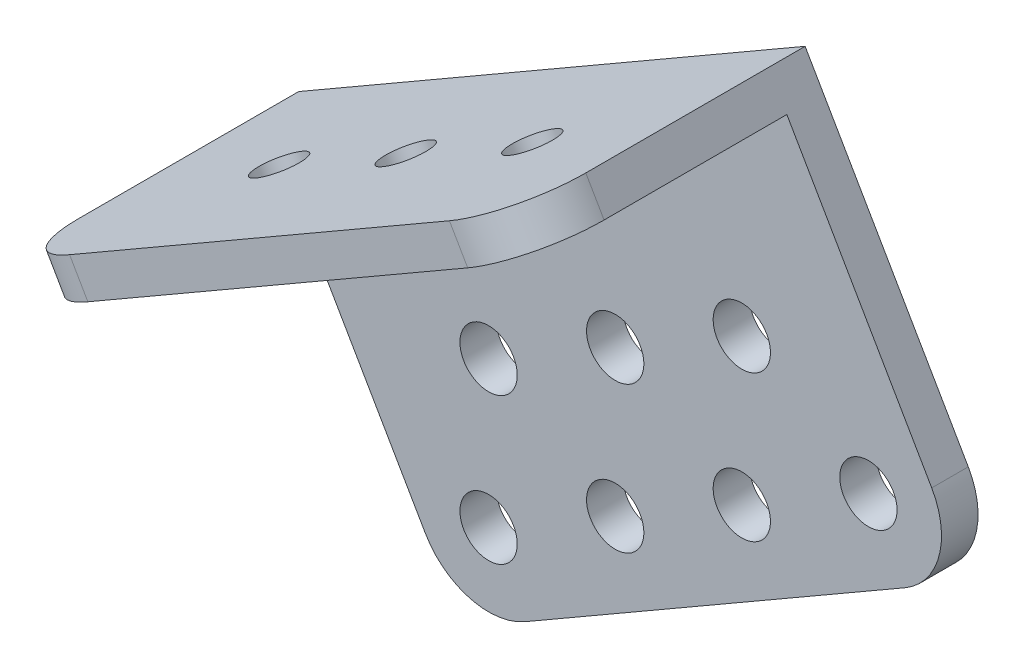
ISO-10303-21;
HEADER;
FILE_DESCRIPTION(('STEP AP214'),'2;1');
FILE_NAME('part.step','',(''),(''),'','','');
FILE_SCHEMA(('AUTOMOTIVE_DESIGN { 1 0 10303 214 1 1 1 1 }'));
ENDSEC;
DATA;
#1=APPLICATION_CONTEXT('core data for automotive mechanical design processes');
#2=APPLICATION_PROTOCOL_DEFINITION('international standard','automotive_design',2000,#1);
#3=PRODUCT_CONTEXT('',#1,'mechanical');
#4=PRODUCT('Part','Part','',(#3));
#5=PRODUCT_RELATED_PRODUCT_CATEGORY('part','',(#4));
#6=PRODUCT_DEFINITION_FORMATION('','',#4);
#7=PRODUCT_DEFINITION_CONTEXT('part definition',#1,'design');
#8=PRODUCT_DEFINITION('design','',#6,#7);
#9=PRODUCT_DEFINITION_SHAPE('','',#8);
#10=(LENGTH_UNIT() NAMED_UNIT(*) SI_UNIT(.MILLI.,.METRE.));
#11=(NAMED_UNIT(*) PLANE_ANGLE_UNIT() SI_UNIT($,.RADIAN.));
#12=(NAMED_UNIT(*) SI_UNIT($,.STERADIAN.) SOLID_ANGLE_UNIT());
#13=UNCERTAINTY_MEASURE_WITH_UNIT(LENGTH_MEASURE(1.E-05),#10,'distance_accuracy_value','');
#14=(GEOMETRIC_REPRESENTATION_CONTEXT(3) GLOBAL_UNCERTAINTY_ASSIGNED_CONTEXT((#13)) GLOBAL_UNIT_ASSIGNED_CONTEXT((#10,
#11,#12)) REPRESENTATION_CONTEXT('',''));
#15=CARTESIAN_POINT('',(0.,0.,0.));
#16=DIRECTION('',(0.,0.,1.));
#17=DIRECTION('',(1.,0.,0.));
#18=AXIS2_PLACEMENT_3D('',#15,#16,#17);
#19=CARTESIAN_POINT('',(0.,0.,-25.4));
#20=DIRECTION('',(0.,0.,-1.));
#21=DIRECTION('',(1.,0.,0.));
#22=AXIS2_PLACEMENT_3D('',#19,#20,#21);
#23=PLANE('',#22);
#24=CARTESIAN_POINT('',(116.913296347439,132.964619955457,-25.4));
#25=DIRECTION('',(0.,0.,1.));
#26=DIRECTION('',(1.,0.,0.));
#27=AXIS2_PLACEMENT_3D('',#24,#25,#26);
#28=CIRCLE('',#27,2.48920000000001);
#29=CARTESIAN_POINT('',(119.402496347439,132.964619955457,-25.4));
#30=VERTEX_POINT('',#29);
#31=EDGE_CURVE('E173',#30,#30,#28,.T.);
#32=ORIENTED_EDGE('',*,*,#31,.T.);
#33=EDGE_LOOP('',(#32));
#34=FACE_BOUND('',#33,.T.);
#35=CARTESIAN_POINT('',(138.910341603564,132.964619955457,-25.4));
#36=DIRECTION('',(0.,0.,1.));
#37=DIRECTION('',(1.,0.,0.));
#38=AXIS2_PLACEMENT_3D('',#35,#36,#37);
#39=CIRCLE('',#38,2.48920000000001);
#40=CARTESIAN_POINT('',(141.399541603564,132.964619955457,-25.4));
#41=VERTEX_POINT('',#40);
#42=EDGE_CURVE('E179',#41,#41,#39,.T.);
#43=ORIENTED_EDGE('',*,*,#42,.T.);
#44=EDGE_LOOP('',(#43));
#45=FACE_BOUND('',#44,.T.);
#46=CARTESIAN_POINT('',(116.913296347439,120.264619955457,-25.4));
#47=DIRECTION('',(0.,0.,1.));
#48=DIRECTION('',(1.,0.,0.));
#49=AXIS2_PLACEMENT_3D('',#46,#47,#48);
#50=CIRCLE('',#49,2.4892);
#51=CARTESIAN_POINT('',(119.402496347439,120.264619955457,-25.4));
#52=VERTEX_POINT('',#51);
#53=EDGE_CURVE('E185',#52,#52,#50,.T.);
#54=ORIENTED_EDGE('',*,*,#53,.T.);
#55=EDGE_LOOP('',(#54));
#56=FACE_BOUND('',#55,.T.);
#57=DIRECTION('',(0.866025403784439,0.5,0.));
#58=VECTOR('',#57,1.);
#59=CARTESIAN_POINT('',(103.590512405345,105.240358641426,-25.4));
#60=LINE('',#59,#58);
#61=CARTESIAN_POINT('',(109.089773719377,108.415358641426,-25.4));
#62=VERTEX_POINT('',#61);
#63=CARTESIAN_POINT('',(142.085341603564,127.465358641426,-25.4));
#64=VERTEX_POINT('',#63);
#65=EDGE_CURVE('E192',#62,#64,#60,.T.);
#66=ORIENTED_EDGE('',*,*,#65,.F.);
#67=CARTESIAN_POINT('',(105.914773719377,113.914619955457,-25.4));
#68=DIRECTION('',(0.,0.,1.));
#69=DIRECTION('',(1.,0.,0.));
#70=AXIS2_PLACEMENT_3D('',#67,#68,#69);
#71=CIRCLE('',#70,6.35);
#72=CARTESIAN_POINT('',(100.415512405345,110.739619955457,-25.4));
#73=VERTEX_POINT('',#72);
#74=EDGE_CURVE('E231',#73,#62,#71,.T.);
#75=ORIENTED_EDGE('',*,*,#74,.F.);
#76=DIRECTION('',(0.5,-0.866025403784438,0.));
#77=VECTOR('',#76,1.);
#78=CARTESIAN_POINT('',(86.2419897772831,135.288881269488,-25.4));
#79=LINE('',#78,#77);
#80=CARTESIAN_POINT('',(86.2419897772831,135.288881269488,-25.4));
#81=VERTEX_POINT('',#80);
#82=EDGE_CURVE('E201',#81,#73,#79,.T.);
#83=ORIENTED_EDGE('',*,*,#82,.F.);
#84=DIRECTION('',(-0.866025403784439,-0.5,0.));
#85=VECTOR('',#84,1.);
#86=CARTESIAN_POINT('',(86.2419897772831,135.288881269488,-25.4));
#87=LINE('',#86,#85);
#88=CARTESIAN_POINT('',(130.236080289533,160.688881269488,-25.4));
#89=VERTEX_POINT('',#88);
#90=EDGE_CURVE('E198',#89,#81,#87,.T.);
#91=ORIENTED_EDGE('',*,*,#90,.F.);
#92=DIRECTION('',(-0.5,0.866025403784439,0.));
#93=VECTOR('',#92,1.);
#94=CARTESIAN_POINT('',(147.584602917595,130.640358641426,-25.4));
#95=LINE('',#94,#93);
#96=CARTESIAN_POINT('',(144.409602917595,136.139619955457,-25.4));
#97=VERTEX_POINT('',#96);
#98=EDGE_CURVE('E195',#97,#89,#95,.T.);
#99=ORIENTED_EDGE('',*,*,#98,.F.);
#100=CARTESIAN_POINT('',(138.910341603564,132.964619955457,-25.4));
#101=DIRECTION('',(0.,0.,1.));
#102=DIRECTION('',(1.,0.,0.));
#103=AXIS2_PLACEMENT_3D('',#100,#101,#102);
#104=CIRCLE('',#103,6.35);
#105=EDGE_CURVE('E234',#64,#97,#104,.T.);
#106=ORIENTED_EDGE('',*,*,#105,.F.);
#107=EDGE_LOOP('',(#66,#75,#83,#91,#99,#106));
#108=FACE_BOUND('',#107,.T.);
#109=CARTESIAN_POINT('',(105.914773719377,113.914619955457,-25.4));
#110=DIRECTION('',(0.,0.,1.));
#111=DIRECTION('',(1.,0.,0.));
#112=AXIS2_PLACEMENT_3D('',#109,#110,#111);
#113=CIRCLE('',#112,2.4892);
#114=CARTESIAN_POINT('',(108.403973719377,113.914619955457,-25.4));
#115=VERTEX_POINT('',#114);
#116=EDGE_CURVE('E188',#115,#115,#113,.T.);
#117=ORIENTED_EDGE('',*,*,#116,.T.);
#118=EDGE_LOOP('',(#117));
#119=FACE_BOUND('',#118,.T.);
#120=CARTESIAN_POINT('',(127.911818975501,126.614619955457,-25.4));
#121=DIRECTION('',(0.,0.,1.));
#122=DIRECTION('',(1.,0.,0.));
#123=AXIS2_PLACEMENT_3D('',#120,#121,#122);
#124=CIRCLE('',#123,2.48919999999997);
#125=CARTESIAN_POINT('',(130.401018975501,126.614619955457,-25.4));
#126=VERTEX_POINT('',#125);
#127=EDGE_CURVE('E182',#126,#126,#124,.T.);
#128=ORIENTED_EDGE('',*,*,#127,.T.);
#129=EDGE_LOOP('',(#128));
#130=FACE_BOUND('',#129,.T.);
#131=CARTESIAN_POINT('',(127.911818975501,139.314619955457,-25.4));
#132=DIRECTION('',(0.,0.,1.));
#133=DIRECTION('',(1.,0.,0.));
#134=AXIS2_PLACEMENT_3D('',#131,#132,#133);
#135=CIRCLE('',#134,2.48919999999997);
#136=CARTESIAN_POINT('',(130.401018975501,139.314619955457,-25.4));
#137=VERTEX_POINT('',#136);
#138=EDGE_CURVE('E176',#137,#137,#135,.T.);
#139=ORIENTED_EDGE('',*,*,#138,.T.);
#140=EDGE_LOOP('',(#139));
#141=FACE_BOUND('',#140,.T.);
#142=CARTESIAN_POINT('',(105.914773719377,126.614619955457,-25.4));
#143=DIRECTION('',(0.,0.,1.));
#144=DIRECTION('',(1.,0.,0.));
#145=AXIS2_PLACEMENT_3D('',#142,#143,#144);
#146=CIRCLE('',#145,2.48919999999998);
#147=CARTESIAN_POINT('',(108.403973719377,126.614619955457,-25.4));
#148=VERTEX_POINT('',#147);
#149=EDGE_CURVE('E170',#148,#148,#146,.T.);
#150=ORIENTED_EDGE('',*,*,#149,.T.);
#151=EDGE_LOOP('',(#150));
#152=FACE_BOUND('',#151,.T.);
#153=ADVANCED_FACE('F35',(#34,#45,#56,#108,#119,#130,#141,#152),#23,.T.);
#154=CARTESIAN_POINT('',(0.,0.,0.));
#155=DIRECTION('',(0.,0.,-1.));
#156=DIRECTION('',(1.,0.,0.));
#157=AXIS2_PLACEMENT_3D('',#154,#155,#156);
#158=PLANE('',#157);
#159=DIRECTION('',(-0.866025403784438,-0.500000000000001,0.));
#160=VECTOR('',#159,1.);
#161=CARTESIAN_POINT('',(144.834972260579,165.451381269489,0.));
#162=LINE('',#161,#160);
#163=CARTESIAN_POINT('',(126.324318975501,154.764250612473,0.));
#164=VERTEX_POINT('',#163);
#165=CARTESIAN_POINT('',(93.3287510913142,135.714250612473,0.));
#166=VERTEX_POINT('',#165);
#167=EDGE_CURVE('E121',#164,#166,#162,.T.);
#168=ORIENTED_EDGE('',*,*,#167,.F.);
#169=DIRECTION('',(-0.5,0.866025403784439,0.));
#170=VECTOR('',#169,1.);
#171=CARTESIAN_POINT('',(161.758125545657,93.3910973273946,0.));
#172=LINE('',#171,#170);
#173=CARTESIAN_POINT('',(124.736818975501,157.513881269488,0.));
#174=VERTEX_POINT('',#173);
#175=EDGE_CURVE('E243',#174,#164,#172,.F.);
#176=ORIENTED_EDGE('',*,*,#175,.F.);
#177=DIRECTION('',(-0.866025403784439,-0.5,0.));
#178=VECTOR('',#177,1.);
#179=CARTESIAN_POINT('',(86.2419897772831,135.288881269488,0.));
#180=LINE('',#179,#178);
#181=CARTESIAN_POINT('',(91.7412510913142,138.463881269488,0.));
#182=VERTEX_POINT('',#181);
#183=EDGE_CURVE('E191',#174,#182,#180,.T.);
#184=ORIENTED_EDGE('',*,*,#183,.T.);
#185=DIRECTION('',(0.5,-0.866025403784438,0.));
#186=VECTOR('',#185,1.);
#187=CARTESIAN_POINT('',(128.76255766147,74.3410973273947,0.));
#188=LINE('',#187,#186);
#189=EDGE_CURVE('E245',#166,#182,#188,.F.);
#190=ORIENTED_EDGE('',*,*,#189,.F.);
#191=EDGE_LOOP('',(#168,#176,#184,#190));
#192=FACE_BOUND('',#191,.T.);
#193=ADVANCED_FACE('F252',(#192),#158,.F.);
#194=CARTESIAN_POINT('',(103.590512405345,105.240358641426,-25.4));
#195=DIRECTION('',(-0.5,0.866025403784439,0.));
#196=DIRECTION('',(-0.866025403784439,-0.5,0.));
#197=AXIS2_PLACEMENT_3D('',#194,#195,#196);
#198=PLANE('',#197);
#199=DIRECTION('',(-0.866025403784438,-0.500000000000001,0.));
#200=VECTOR('',#199,1.);
#201=CARTESIAN_POINT('',(160.595994888642,138.152489298442,-22.225));
#202=LINE('',#201,#200);
#203=CARTESIAN_POINT('',(142.085341603564,127.465358641426,-22.225));
#204=VERTEX_POINT('',#203);
#205=CARTESIAN_POINT('',(109.089773719377,108.415358641426,-22.225));
#206=VERTEX_POINT('',#205);
#207=EDGE_CURVE('E122',#204,#206,#202,.T.);
#208=ORIENTED_EDGE('',*,*,#207,.T.);
#209=DIRECTION('',(0.,0.,1.));
#210=VECTOR('',#209,1.);
#211=CARTESIAN_POINT('',(109.089773719377,108.415358641426,-25.4));
#212=LINE('',#211,#210);
#213=EDGE_CURVE('E226',#62,#206,#212,.T.);
#214=ORIENTED_EDGE('',*,*,#213,.F.);
#215=ORIENTED_EDGE('',*,*,#65,.T.);
#216=DIRECTION('',(0.,0.,1.));
#217=VECTOR('',#216,1.);
#218=CARTESIAN_POINT('',(142.085341603564,127.465358641426,-25.4));
#219=LINE('',#218,#217);
#220=EDGE_CURVE('E229',#204,#64,#219,.F.);
#221=ORIENTED_EDGE('',*,*,#220,.F.);
#222=EDGE_LOOP('',(#208,#214,#215,#221));
#223=FACE_BOUND('',#222,.T.);
#224=ADVANCED_FACE('F270',(#223),#198,.F.);
#225=CARTESIAN_POINT('',(147.584602917595,130.640358641426,-25.4));
#226=DIRECTION('',(-0.866025403784439,-0.5,0.));
#227=DIRECTION('',(0.5,-0.866025403784439,0.));
#228=AXIS2_PLACEMENT_3D('',#225,#226,#227);
#229=PLANE('',#228);
#230=ORIENTED_EDGE('',*,*,#98,.T.);
#231=DIRECTION('',(0.,0.,1.));
#232=VECTOR('',#231,1.);
#233=CARTESIAN_POINT('',(130.236080289533,160.688881269488,-25.4));
#234=LINE('',#233,#232);
#235=CARTESIAN_POINT('',(130.236080289533,160.688881269488,-6.35));
#236=VERTEX_POINT('',#235);
#237=EDGE_CURVE('E207',#89,#236,#234,.T.);
#238=ORIENTED_EDGE('',*,*,#237,.T.);
#239=DIRECTION('',(-0.5,0.866025403784439,0.));
#240=VECTOR('',#239,1.);
#241=CARTESIAN_POINT('',(147.584602917595,130.640358641426,-6.35));
#242=LINE('',#241,#240);
#243=CARTESIAN_POINT('',(131.823580289533,157.939250612473,-6.35));
#244=VERTEX_POINT('',#243);
#245=EDGE_CURVE('E210',#244,#236,#242,.T.);
#246=ORIENTED_EDGE('',*,*,#245,.F.);
#247=DIRECTION('',(0.,0.,1.));
#248=VECTOR('',#247,1.);
#249=CARTESIAN_POINT('',(131.823580289533,157.939250612473,-25.4));
#250=LINE('',#249,#248);
#251=CARTESIAN_POINT('',(131.823580289533,157.939250612473,-22.225));
#252=VERTEX_POINT('',#251);
#253=EDGE_CURVE('E168',#252,#244,#250,.T.);
#254=ORIENTED_EDGE('',*,*,#253,.F.);
#255=DIRECTION('',(-0.5,0.866025403784439,0.));
#256=VECTOR('',#255,1.);
#257=CARTESIAN_POINT('',(147.584602917595,130.640358641426,-22.225));
#258=LINE('',#257,#256);
#259=CARTESIAN_POINT('',(144.409602917595,136.139619955457,-22.225));
#260=VERTEX_POINT('',#259);
#261=EDGE_CURVE('E117',#260,#252,#258,.T.);
#262=ORIENTED_EDGE('',*,*,#261,.F.);
#263=DIRECTION('',(0.,0.,1.));
#264=VECTOR('',#263,1.);
#265=CARTESIAN_POINT('',(144.409602917595,136.139619955457,-25.4));
#266=LINE('',#265,#264);
#267=EDGE_CURVE('E219',#97,#260,#266,.T.);
#268=ORIENTED_EDGE('',*,*,#267,.F.);
#269=EDGE_LOOP('',(#230,#238,#246,#254,#262,#268));
#270=FACE_BOUND('',#269,.T.);
#271=ADVANCED_FACE('F256',(#270),#229,.F.);
#272=CARTESIAN_POINT('',(86.2419897772831,135.288881269488,-25.4));
#273=DIRECTION('',(0.5,-0.866025403784439,0.));
#274=DIRECTION('',(0.866025403784439,0.5,0.));
#275=AXIS2_PLACEMENT_3D('',#272,#273,#274);
#276=PLANE('',#275);
#277=CARTESIAN_POINT('',(108.239035033408,147.988881269489,-12.7));
#278=DIRECTION('',(0.5,-0.866025403784439,0.));
#279=DIRECTION('',(-0.866025403784439,-0.5,0.));
#280=AXIS2_PLACEMENT_3D('',#277,#278,#279);
#281=CIRCLE('',#280,2.01930000000001);
#282=CARTESIAN_POINT('',(106.490269935546,146.979231269489,-12.7));
#283=VERTEX_POINT('',#282);
#284=EDGE_CURVE('E482',#283,#283,#281,.T.);
#285=ORIENTED_EDGE('',*,*,#284,.T.);
#286=EDGE_LOOP('',(#285));
#287=FACE_BOUND('',#286,.T.);
#288=CARTESIAN_POINT('',(119.23755766147,154.338881269489,-12.7));
#289=DIRECTION('',(0.5,-0.866025403784439,0.));
#290=DIRECTION('',(-0.866025403784439,-0.5,0.));
#291=AXIS2_PLACEMENT_3D('',#288,#289,#290);
#292=CIRCLE('',#291,2.01929999999999);
#293=CARTESIAN_POINT('',(117.488792563608,153.329231269489,-12.7));
#294=VERTEX_POINT('',#293);
#295=EDGE_CURVE('E475',#294,#294,#292,.T.);
#296=ORIENTED_EDGE('',*,*,#295,.T.);
#297=EDGE_LOOP('',(#296));
#298=FACE_BOUND('',#297,.T.);
#299=CARTESIAN_POINT('',(97.2405124053454,141.638881269489,-12.7));
#300=DIRECTION('',(0.5,-0.866025403784439,0.));
#301=DIRECTION('',(-0.866025403784439,-0.5,0.));
#302=AXIS2_PLACEMENT_3D('',#299,#300,#301);
#303=CIRCLE('',#302,2.01930000000002);
#304=CARTESIAN_POINT('',(95.4917473074835,140.629231269489,-12.7));
#305=VERTEX_POINT('',#304);
#306=EDGE_CURVE('E142',#305,#305,#303,.T.);
#307=ORIENTED_EDGE('',*,*,#306,.T.);
#308=EDGE_LOOP('',(#307));
#309=FACE_BOUND('',#308,.T.);
#310=ORIENTED_EDGE('',*,*,#183,.F.);
#311=CARTESIAN_POINT('',(124.736818975501,157.513881269488,-6.35));
#312=DIRECTION('',(-0.5,0.866025403784439,0.));
#313=DIRECTION('',(0.866025403784439,0.5,0.));
#314=AXIS2_PLACEMENT_3D('',#311,#312,#313);
#315=CIRCLE('',#314,6.35);
#316=EDGE_CURVE('E43',#236,#174,#315,.F.);
#317=ORIENTED_EDGE('',*,*,#316,.F.);
#318=ORIENTED_EDGE('',*,*,#237,.F.);
#319=ORIENTED_EDGE('',*,*,#90,.T.);
#320=DIRECTION('',(0.,0.,1.));
#321=VECTOR('',#320,1.);
#322=CARTESIAN_POINT('',(86.2419897772831,135.288881269488,-25.4));
#323=LINE('',#322,#321);
#324=CARTESIAN_POINT('',(86.2419897772831,135.288881269488,-6.35));
#325=VERTEX_POINT('',#324);
#326=EDGE_CURVE('E203',#81,#325,#323,.T.);
#327=ORIENTED_EDGE('',*,*,#326,.T.);
#328=CARTESIAN_POINT('',(91.7412510913142,138.463881269488,-6.35));
#329=DIRECTION('',(-0.5,0.866025403784439,0.));
#330=DIRECTION('',(0.866025403784439,0.5,0.));
#331=AXIS2_PLACEMENT_3D('',#328,#329,#330);
#332=CIRCLE('',#331,6.35);
#333=EDGE_CURVE('E11',#182,#325,#332,.F.);
#334=ORIENTED_EDGE('',*,*,#333,.F.);
#335=EDGE_LOOP('',(#310,#317,#318,#319,#327,#334));
#336=FACE_BOUND('',#335,.T.);
#337=ADVANCED_FACE('F253',(#287,#298,#309,#336),#276,.F.);
#338=CARTESIAN_POINT('',(86.2419897772831,135.288881269488,-25.4));
#339=DIRECTION('',(0.866025403784438,0.5,0.));
#340=DIRECTION('',(-0.5,0.866025403784438,0.));
#341=AXIS2_PLACEMENT_3D('',#338,#339,#340);
#342=PLANE('',#341);
#343=DIRECTION('',(-0.500000000000001,0.866025403784438,0.));
#344=VECTOR('',#343,1.);
#345=CARTESIAN_POINT('',(103.590512405345,105.240358641426,-22.225));
#346=LINE('',#345,#344);
#347=CARTESIAN_POINT('',(100.415512405345,110.739619955457,-22.225));
#348=VERTEX_POINT('',#347);
#349=CARTESIAN_POINT('',(87.8294897772831,132.539250612473,-22.225));
#350=VERTEX_POINT('',#349);
#351=EDGE_CURVE('E115',#348,#350,#346,.T.);
#352=ORIENTED_EDGE('',*,*,#351,.T.);
#353=DIRECTION('',(0.,0.,1.));
#354=VECTOR('',#353,1.);
#355=CARTESIAN_POINT('',(87.8294897772831,132.539250612473,0.));
#356=LINE('',#355,#354);
#357=CARTESIAN_POINT('',(87.8294897772831,132.539250612473,-6.35));
#358=VERTEX_POINT('',#357);
#359=EDGE_CURVE('E125',#350,#358,#356,.T.);
#360=ORIENTED_EDGE('',*,*,#359,.T.);
#361=DIRECTION('',(0.5,-0.866025403784438,0.));
#362=VECTOR('',#361,1.);
#363=CARTESIAN_POINT('',(86.2419897772831,135.288881269488,-6.35));
#364=LINE('',#363,#362);
#365=EDGE_CURVE('E237',#325,#358,#364,.T.);
#366=ORIENTED_EDGE('',*,*,#365,.F.);
#367=ORIENTED_EDGE('',*,*,#326,.F.);
#368=ORIENTED_EDGE('',*,*,#82,.T.);
#369=DIRECTION('',(0.,0.,1.));
#370=VECTOR('',#369,1.);
#371=CARTESIAN_POINT('',(100.415512405345,110.739619955457,-25.4));
#372=LINE('',#371,#370);
#373=EDGE_CURVE('E135',#348,#73,#372,.F.);
#374=ORIENTED_EDGE('',*,*,#373,.F.);
#375=EDGE_LOOP('',(#352,#360,#366,#367,#368,#374));
#376=FACE_BOUND('',#375,.T.);
#377=ADVANCED_FACE('F133',(#376),#342,.F.);
#378=CARTESIAN_POINT('',(105.914773719377,113.914619955457,-25.4));
#379=DIRECTION('',(0.,0.,1.));
#380=DIRECTION('',(-1.,0.,0.));
#381=AXIS2_PLACEMENT_3D('',#378,#379,#380);
#382=CYLINDRICAL_SURFACE('',#381,2.4892);
#383=CARTESIAN_POINT('',(105.914773719377,113.914619955457,-22.225));
#384=DIRECTION('',(0.,0.,1.));
#385=DIRECTION('',(0.,-1.,0.));
#386=AXIS2_PLACEMENT_3D('',#383,#384,#385);
#387=CIRCLE('',#386,2.4892);
#388=CARTESIAN_POINT('',(105.914773719377,111.425419955457,-22.225));
#389=VERTEX_POINT('',#388);
#390=EDGE_CURVE('E164',#389,#389,#387,.T.);
#391=ORIENTED_EDGE('',*,*,#390,.T.);
#392=EDGE_LOOP('',(#391));
#393=FACE_BOUND('',#392,.T.);
#394=ORIENTED_EDGE('',*,*,#116,.F.);
#395=EDGE_LOOP('',(#394));
#396=FACE_BOUND('',#395,.T.);
#397=ADVANCED_FACE('F294',(#393,#396),#382,.F.);
#398=CARTESIAN_POINT('',(116.913296347439,120.264619955457,-25.4));
#399=DIRECTION('',(0.,0.,1.));
#400=DIRECTION('',(-1.,0.,0.));
#401=AXIS2_PLACEMENT_3D('',#398,#399,#400);
#402=CYLINDRICAL_SURFACE('',#401,2.4892);
#403=CARTESIAN_POINT('',(116.913296347439,120.264619955457,-22.225));
#404=DIRECTION('',(0.,0.,1.));
#405=DIRECTION('',(0.,-1.,0.));
#406=AXIS2_PLACEMENT_3D('',#403,#404,#405);
#407=CIRCLE('',#406,2.4892);
#408=CARTESIAN_POINT('',(116.913296347439,117.775419955457,-22.225));
#409=VERTEX_POINT('',#408);
#410=EDGE_CURVE('E161',#409,#409,#407,.T.);
#411=ORIENTED_EDGE('',*,*,#410,.T.);
#412=EDGE_LOOP('',(#411));
#413=FACE_BOUND('',#412,.T.);
#414=ORIENTED_EDGE('',*,*,#53,.F.);
#415=EDGE_LOOP('',(#414));
#416=FACE_BOUND('',#415,.T.);
#417=ADVANCED_FACE('F326',(#413,#416),#402,.F.);
#418=CARTESIAN_POINT('',(127.911818975501,126.614619955457,-25.4));
#419=DIRECTION('',(0.,0.,1.));
#420=DIRECTION('',(-1.,0.,0.));
#421=AXIS2_PLACEMENT_3D('',#418,#419,#420);
#422=CYLINDRICAL_SURFACE('',#421,2.48919999999997);
#423=CARTESIAN_POINT('',(127.911818975501,126.614619955457,-22.225));
#424=DIRECTION('',(0.,0.,1.));
#425=DIRECTION('',(0.,-1.,0.));
#426=AXIS2_PLACEMENT_3D('',#423,#424,#425);
#427=CIRCLE('',#426,2.48919999999997);
#428=CARTESIAN_POINT('',(127.911818975501,124.125419955457,-22.225));
#429=VERTEX_POINT('',#428);
#430=EDGE_CURVE('E158',#429,#429,#427,.T.);
#431=ORIENTED_EDGE('',*,*,#430,.T.);
#432=EDGE_LOOP('',(#431));
#433=FACE_BOUND('',#432,.T.);
#434=ORIENTED_EDGE('',*,*,#127,.F.);
#435=EDGE_LOOP('',(#434));
#436=FACE_BOUND('',#435,.T.);
#437=ADVANCED_FACE('F333',(#433,#436),#422,.F.);
#438=CARTESIAN_POINT('',(138.910341603564,132.964619955457,-25.4));
#439=DIRECTION('',(0.,0.,1.));
#440=DIRECTION('',(-1.,0.,0.));
#441=AXIS2_PLACEMENT_3D('',#438,#439,#440);
#442=CYLINDRICAL_SURFACE('',#441,2.48920000000001);
#443=CARTESIAN_POINT('',(138.910341603564,132.964619955457,-22.225));
#444=DIRECTION('',(0.,0.,1.));
#445=DIRECTION('',(0.,-1.,0.));
#446=AXIS2_PLACEMENT_3D('',#443,#444,#445);
#447=CIRCLE('',#446,2.48920000000001);
#448=CARTESIAN_POINT('',(138.910341603564,130.475419955457,-22.225));
#449=VERTEX_POINT('',#448);
#450=EDGE_CURVE('E155',#449,#449,#447,.T.);
#451=ORIENTED_EDGE('',*,*,#450,.T.);
#452=EDGE_LOOP('',(#451));
#453=FACE_BOUND('',#452,.T.);
#454=ORIENTED_EDGE('',*,*,#42,.F.);
#455=EDGE_LOOP('',(#454));
#456=FACE_BOUND('',#455,.T.);
#457=ADVANCED_FACE('F340',(#453,#456),#442,.F.);
#458=CARTESIAN_POINT('',(127.911818975501,139.314619955457,-25.4));
#459=DIRECTION('',(0.,0.,1.));
#460=DIRECTION('',(-1.,0.,0.));
#461=AXIS2_PLACEMENT_3D('',#458,#459,#460);
#462=CYLINDRICAL_SURFACE('',#461,2.48919999999997);
#463=CARTESIAN_POINT('',(127.911818975501,139.314619955457,-22.225));
#464=DIRECTION('',(0.,0.,1.));
#465=DIRECTION('',(0.,-1.,0.));
#466=AXIS2_PLACEMENT_3D('',#463,#464,#465);
#467=CIRCLE('',#466,2.48919999999997);
#468=CARTESIAN_POINT('',(127.911818975501,136.825419955457,-22.225));
#469=VERTEX_POINT('',#468);
#470=EDGE_CURVE('E152',#469,#469,#467,.T.);
#471=ORIENTED_EDGE('',*,*,#470,.T.);
#472=EDGE_LOOP('',(#471));
#473=FACE_BOUND('',#472,.T.);
#474=ORIENTED_EDGE('',*,*,#138,.F.);
#475=EDGE_LOOP('',(#474));
#476=FACE_BOUND('',#475,.T.);
#477=ADVANCED_FACE('F348',(#473,#476),#462,.F.);
#478=CARTESIAN_POINT('',(116.913296347439,132.964619955457,-25.4));
#479=DIRECTION('',(0.,0.,1.));
#480=DIRECTION('',(-1.,0.,0.));
#481=AXIS2_PLACEMENT_3D('',#478,#479,#480);
#482=CYLINDRICAL_SURFACE('',#481,2.48920000000001);
#483=CARTESIAN_POINT('',(116.913296347439,132.964619955457,-22.225));
#484=DIRECTION('',(0.,0.,1.));
#485=DIRECTION('',(0.,-1.,0.));
#486=AXIS2_PLACEMENT_3D('',#483,#484,#485);
#487=CIRCLE('',#486,2.48920000000001);
#488=CARTESIAN_POINT('',(116.913296347439,130.475419955457,-22.225));
#489=VERTEX_POINT('',#488);
#490=EDGE_CURVE('E149',#489,#489,#487,.T.);
#491=ORIENTED_EDGE('',*,*,#490,.T.);
#492=EDGE_LOOP('',(#491));
#493=FACE_BOUND('',#492,.T.);
#494=ORIENTED_EDGE('',*,*,#31,.F.);
#495=EDGE_LOOP('',(#494));
#496=FACE_BOUND('',#495,.T.);
#497=ADVANCED_FACE('F356',(#493,#496),#482,.F.);
#498=CARTESIAN_POINT('',(105.914773719377,126.614619955457,-25.4));
#499=DIRECTION('',(0.,0.,1.));
#500=DIRECTION('',(-1.,0.,0.));
#501=AXIS2_PLACEMENT_3D('',#498,#499,#500);
#502=CYLINDRICAL_SURFACE('',#501,2.48919999999998);
#503=CARTESIAN_POINT('',(105.914773719377,126.614619955457,-22.225));
#504=DIRECTION('',(0.,0.,1.));
#505=DIRECTION('',(0.,-1.,0.));
#506=AXIS2_PLACEMENT_3D('',#503,#504,#505);
#507=CIRCLE('',#506,2.48919999999998);
#508=CARTESIAN_POINT('',(105.914773719377,124.125419955457,-22.225));
#509=VERTEX_POINT('',#508);
#510=EDGE_CURVE('E145',#509,#509,#507,.T.);
#511=ORIENTED_EDGE('',*,*,#510,.T.);
#512=EDGE_LOOP('',(#511));
#513=FACE_BOUND('',#512,.T.);
#514=ORIENTED_EDGE('',*,*,#149,.F.);
#515=EDGE_LOOP('',(#514));
#516=FACE_BOUND('',#515,.T.);
#517=ADVANCED_FACE('F364',(#513,#516),#502,.F.);
#518=CARTESIAN_POINT('',(144.834972260579,165.451381269489,0.));
#519=DIRECTION('',(-0.500000000000001,0.866025403784438,0.));
#520=DIRECTION('',(-0.866025403784438,-0.500000000000001,0.));
#521=AXIS2_PLACEMENT_3D('',#518,#519,#520);
#522=PLANE('',#521);
#523=CARTESIAN_POINT('',(109.826535033408,145.239250612473,-12.7));
#524=DIRECTION('',(0.500000000000001,-0.866025403784438,0.));
#525=DIRECTION('',(-0.866025403784438,-0.500000000000001,0.));
#526=AXIS2_PLACEMENT_3D('',#523,#524,#525);
#527=CIRCLE('',#526,2.01930000000001);
#528=CARTESIAN_POINT('',(108.077769935546,144.229600612473,-12.7));
#529=VERTEX_POINT('',#528);
#530=EDGE_CURVE('E136',#529,#529,#527,.T.);
#531=ORIENTED_EDGE('',*,*,#530,.F.);
#532=EDGE_LOOP('',(#531));
#533=FACE_BOUND('',#532,.T.);
#534=CARTESIAN_POINT('',(120.82505766147,151.589250612473,-12.7));
#535=DIRECTION('',(0.500000000000001,-0.866025403784438,0.));
#536=DIRECTION('',(-0.866025403784438,-0.500000000000001,0.));
#537=AXIS2_PLACEMENT_3D('',#534,#535,#536);
#538=CIRCLE('',#537,2.01929999999999);
#539=CARTESIAN_POINT('',(119.076292563608,150.579600612473,-12.7));
#540=VERTEX_POINT('',#539);
#541=EDGE_CURVE('E139',#540,#540,#538,.T.);
#542=ORIENTED_EDGE('',*,*,#541,.F.);
#543=EDGE_LOOP('',(#542));
#544=FACE_BOUND('',#543,.T.);
#545=CARTESIAN_POINT('',(98.8280124053455,138.889250612473,-12.7));
#546=DIRECTION('',(0.500000000000001,-0.866025403784438,0.));
#547=DIRECTION('',(-0.866025403784438,-0.500000000000001,0.));
#548=AXIS2_PLACEMENT_3D('',#545,#546,#547);
#549=CIRCLE('',#548,2.01930000000002);
#550=CARTESIAN_POINT('',(97.0792473074835,137.879600612473,-12.7));
#551=VERTEX_POINT('',#550);
#552=EDGE_CURVE('E213',#551,#551,#549,.T.);
#553=ORIENTED_EDGE('',*,*,#552,.F.);
#554=EDGE_LOOP('',(#553));
#555=FACE_BOUND('',#554,.T.);
#556=ORIENTED_EDGE('',*,*,#359,.F.);
#557=DIRECTION('',(-0.866025403784438,-0.500000000000001,0.));
#558=VECTOR('',#557,1.);
#559=CARTESIAN_POINT('',(144.834972260579,165.451381269489,-22.225));
#560=LINE('',#559,#558);
#561=EDGE_CURVE('E111',#252,#350,#560,.T.);
#562=ORIENTED_EDGE('',*,*,#561,.F.);
#563=ORIENTED_EDGE('',*,*,#253,.T.);
#564=CARTESIAN_POINT('',(126.324318975501,154.764250612473,-6.35));
#565=DIRECTION('',(0.500000000000001,-0.866025403784438,0.));
#566=DIRECTION('',(-0.866025403784438,-0.500000000000001,0.));
#567=AXIS2_PLACEMENT_3D('',#564,#565,#566);
#568=CIRCLE('',#567,6.35);
#569=EDGE_CURVE('E240',#164,#244,#568,.F.);
#570=ORIENTED_EDGE('',*,*,#569,.F.);
#571=ORIENTED_EDGE('',*,*,#167,.T.);
#572=CARTESIAN_POINT('',(93.3287510913142,135.714250612473,-6.35));
#573=DIRECTION('',(0.500000000000001,-0.866025403784438,0.));
#574=DIRECTION('',(-0.866025403784438,-0.500000000000001,0.));
#575=AXIS2_PLACEMENT_3D('',#572,#573,#574);
#576=CIRCLE('',#575,6.35);
#577=EDGE_CURVE('E128',#358,#166,#576,.F.);
#578=ORIENTED_EDGE('',*,*,#577,.F.);
#579=EDGE_LOOP('',(#556,#562,#563,#570,#571,#578));
#580=FACE_BOUND('',#579,.T.);
#581=ADVANCED_FACE('F126',(#533,#544,#555,#580),#522,.F.);
#582=CARTESIAN_POINT('',(160.595994888642,138.152489298442,-22.225));
#583=DIRECTION('',(0.,0.,-1.));
#584=DIRECTION('',(0.,-1.,0.));
#585=AXIS2_PLACEMENT_3D('',#582,#583,#584);
#586=PLANE('',#585);
#587=ORIENTED_EDGE('',*,*,#390,.F.);
#588=EDGE_LOOP('',(#587));
#589=FACE_BOUND('',#588,.T.);
#590=ORIENTED_EDGE('',*,*,#410,.F.);
#591=EDGE_LOOP('',(#590));
#592=FACE_BOUND('',#591,.T.);
#593=ORIENTED_EDGE('',*,*,#430,.F.);
#594=EDGE_LOOP('',(#593));
#595=FACE_BOUND('',#594,.T.);
#596=ORIENTED_EDGE('',*,*,#450,.F.);
#597=EDGE_LOOP('',(#596));
#598=FACE_BOUND('',#597,.T.);
#599=ORIENTED_EDGE('',*,*,#470,.F.);
#600=EDGE_LOOP('',(#599));
#601=FACE_BOUND('',#600,.T.);
#602=ORIENTED_EDGE('',*,*,#490,.F.);
#603=EDGE_LOOP('',(#602));
#604=FACE_BOUND('',#603,.T.);
#605=ORIENTED_EDGE('',*,*,#510,.F.);
#606=EDGE_LOOP('',(#605));
#607=FACE_BOUND('',#606,.T.);
#608=ORIENTED_EDGE('',*,*,#261,.T.);
#609=ORIENTED_EDGE('',*,*,#561,.T.);
#610=ORIENTED_EDGE('',*,*,#351,.F.);
#611=CARTESIAN_POINT('',(105.914773719377,113.914619955457,-22.225));
#612=DIRECTION('',(0.,0.,1.));
#613=DIRECTION('',(0.,-1.,0.));
#614=AXIS2_PLACEMENT_3D('',#611,#612,#613);
#615=CIRCLE('',#614,6.35);
#616=EDGE_CURVE('E222',#206,#348,#615,.F.);
#617=ORIENTED_EDGE('',*,*,#616,.F.);
#618=ORIENTED_EDGE('',*,*,#207,.F.);
#619=CARTESIAN_POINT('',(138.910341603564,132.964619955457,-22.225));
#620=DIRECTION('',(0.,0.,1.));
#621=DIRECTION('',(0.,-1.,0.));
#622=AXIS2_PLACEMENT_3D('',#619,#620,#621);
#623=CIRCLE('',#622,6.35);
#624=EDGE_CURVE('E224',#260,#204,#623,.F.);
#625=ORIENTED_EDGE('',*,*,#624,.F.);
#626=EDGE_LOOP('',(#608,#609,#610,#617,#618,#625));
#627=FACE_BOUND('',#626,.T.);
#628=ADVANCED_FACE('F113',(#589,#592,#595,#598,#601,#604,#607,#627),#586,.F.);
#629=CARTESIAN_POINT('',(125.58755766147,92.5403586414263,-12.7));
#630=DIRECTION('',(-0.5,0.866025403784439,0.));
#631=DIRECTION('',(-0.866025403784439,-0.5,0.));
#632=AXIS2_PLACEMENT_3D('',#629,#630,#631);
#633=CYLINDRICAL_SURFACE('',#632,2.01930000000002);
#634=ORIENTED_EDGE('',*,*,#306,.F.);
#635=EDGE_LOOP('',(#634));
#636=FACE_BOUND('',#635,.T.);
#637=ORIENTED_EDGE('',*,*,#552,.T.);
#638=EDGE_LOOP('',(#637));
#639=FACE_BOUND('',#638,.T.);
#640=ADVANCED_FACE('F386',(#636,#639),#633,.F.);
#641=CARTESIAN_POINT('',(147.584602917595,105.240358641426,-12.7));
#642=DIRECTION('',(-0.5,0.866025403784439,0.));
#643=DIRECTION('',(-0.866025403784439,-0.5,0.));
#644=AXIS2_PLACEMENT_3D('',#641,#642,#643);
#645=CYLINDRICAL_SURFACE('',#644,2.01929999999999);
#646=ORIENTED_EDGE('',*,*,#295,.F.);
#647=EDGE_LOOP('',(#646));
#648=FACE_BOUND('',#647,.T.);
#649=ORIENTED_EDGE('',*,*,#541,.T.);
#650=EDGE_LOOP('',(#649));
#651=FACE_BOUND('',#650,.T.);
#652=ADVANCED_FACE('F281',(#648,#651),#645,.F.);
#653=CARTESIAN_POINT('',(136.586080289533,98.8903586414262,-12.7));
#654=DIRECTION('',(-0.5,0.866025403784439,0.));
#655=DIRECTION('',(-0.866025403784439,-0.5,0.));
#656=AXIS2_PLACEMENT_3D('',#653,#654,#655);
#657=CYLINDRICAL_SURFACE('',#656,2.01930000000001);
#658=ORIENTED_EDGE('',*,*,#284,.F.);
#659=EDGE_LOOP('',(#658));
#660=FACE_BOUND('',#659,.T.);
#661=ORIENTED_EDGE('',*,*,#530,.T.);
#662=EDGE_LOOP('',(#661));
#663=FACE_BOUND('',#662,.T.);
#664=ADVANCED_FACE('F274',(#660,#663),#657,.F.);
#665=CARTESIAN_POINT('',(138.910341603564,132.964619955457,-25.4));
#666=DIRECTION('',(0.,0.,1.));
#667=DIRECTION('',(-1.,0.,0.));
#668=AXIS2_PLACEMENT_3D('',#665,#666,#667);
#669=CYLINDRICAL_SURFACE('',#668,6.35);
#670=ORIENTED_EDGE('',*,*,#105,.T.);
#671=ORIENTED_EDGE('',*,*,#267,.T.);
#672=ORIENTED_EDGE('',*,*,#624,.T.);
#673=ORIENTED_EDGE('',*,*,#220,.T.);
#674=EDGE_LOOP('',(#670,#671,#672,#673));
#675=FACE_BOUND('',#674,.T.);
#676=ADVANCED_FACE('F272',(#675),#669,.T.);
#677=CARTESIAN_POINT('',(105.914773719377,113.914619955457,-25.4));
#678=DIRECTION('',(0.,0.,1.));
#679=DIRECTION('',(-1.,0.,0.));
#680=AXIS2_PLACEMENT_3D('',#677,#678,#679);
#681=CYLINDRICAL_SURFACE('',#680,6.35);
#682=ORIENTED_EDGE('',*,*,#74,.T.);
#683=ORIENTED_EDGE('',*,*,#213,.T.);
#684=ORIENTED_EDGE('',*,*,#616,.T.);
#685=ORIENTED_EDGE('',*,*,#373,.T.);
#686=EDGE_LOOP('',(#682,#683,#684,#685));
#687=FACE_BOUND('',#686,.T.);
#688=ADVANCED_FACE('F266',(#687),#681,.T.);
#689=CARTESIAN_POINT('',(91.7412510913142,138.463881269488,-6.35));
#690=DIRECTION('',(0.5,-0.866025403784438,0.));
#691=DIRECTION('',(0.866025403784438,0.5,0.));
#692=AXIS2_PLACEMENT_3D('',#689,#690,#691);
#693=CYLINDRICAL_SURFACE('',#692,6.35);
#694=ORIENTED_EDGE('',*,*,#333,.T.);
#695=ORIENTED_EDGE('',*,*,#365,.T.);
#696=ORIENTED_EDGE('',*,*,#577,.T.);
#697=ORIENTED_EDGE('',*,*,#189,.T.);
#698=EDGE_LOOP('',(#694,#695,#696,#697));
#699=FACE_BOUND('',#698,.T.);
#700=ADVANCED_FACE('F248',(#699),#693,.T.);
#701=CARTESIAN_POINT('',(142.085341603564,127.465358641426,-6.35));
#702=DIRECTION('',(-0.5,0.866025403784439,0.));
#703=DIRECTION('',(-0.866025403784439,-0.5,0.));
#704=AXIS2_PLACEMENT_3D('',#701,#702,#703);
#705=CYLINDRICAL_SURFACE('',#704,6.35);
#706=ORIENTED_EDGE('',*,*,#569,.T.);
#707=ORIENTED_EDGE('',*,*,#245,.T.);
#708=ORIENTED_EDGE('',*,*,#316,.T.);
#709=ORIENTED_EDGE('',*,*,#175,.T.);
#710=EDGE_LOOP('',(#706,#707,#708,#709));
#711=FACE_BOUND('',#710,.T.);
#712=ADVANCED_FACE('F37',(#711),#705,.T.);
#713=CLOSED_SHELL('',(#153,#193,#224,#271,#337,#377,#397,#417,#437,#457,#477,#497,#517,#581,
#628,#640,#652,#664,#676,#688,#700,#712));
#714=MANIFOLD_SOLID_BREP('B2',#713);
#715=ADVANCED_BREP_SHAPE_REPRESENTATION('',(#18,#714),#14);
#716=SHAPE_DEFINITION_REPRESENTATION(#9,#715);
ENDSEC;
END-ISO-10303-21;
